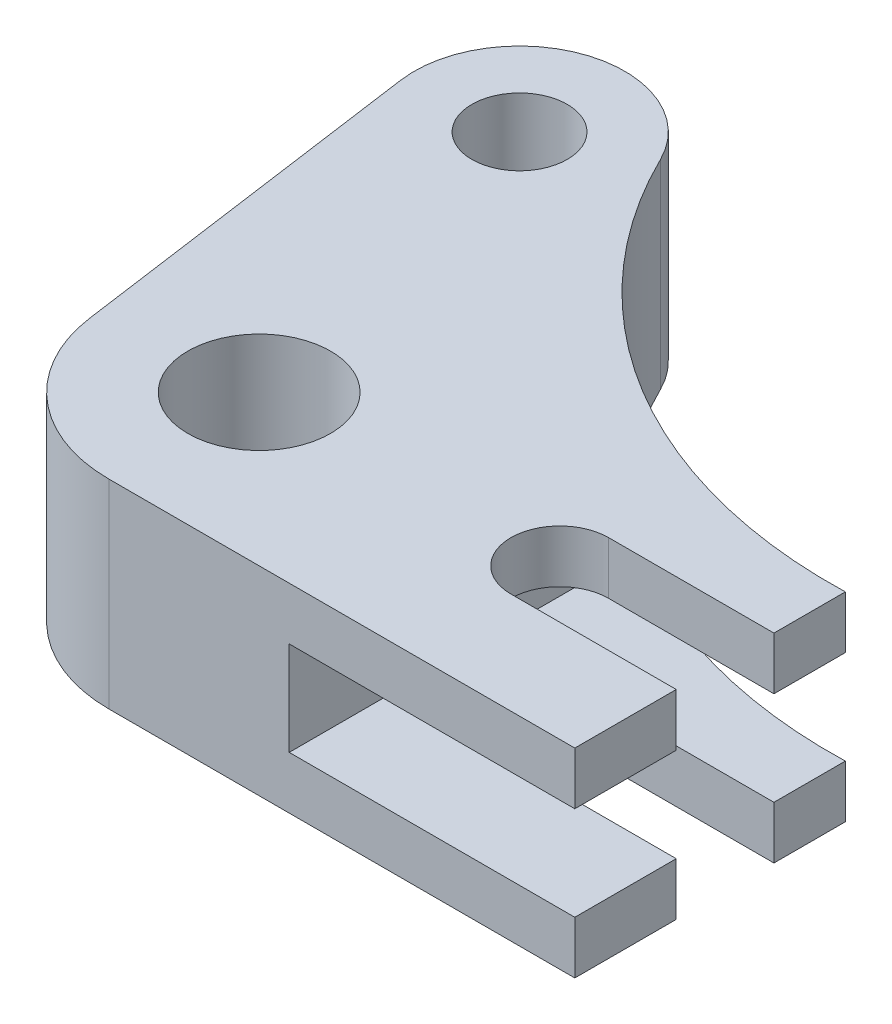
ISO-10303-21;
HEADER;
FILE_DESCRIPTION(('STEP AP214'),'2;1');
FILE_NAME('part.step','',(''),(''),'','','');
FILE_SCHEMA(('AUTOMOTIVE_DESIGN { 1 0 10303 214 1 1 1 1 }'));
ENDSEC;
DATA;
#1=APPLICATION_CONTEXT('core data for automotive mechanical design processes');
#2=APPLICATION_PROTOCOL_DEFINITION('international standard','automotive_design',2000,#1);
#3=PRODUCT_CONTEXT('',#1,'mechanical');
#4=PRODUCT('Part','Part','',(#3));
#5=PRODUCT_RELATED_PRODUCT_CATEGORY('part','',(#4));
#6=PRODUCT_DEFINITION_FORMATION('','',#4);
#7=PRODUCT_DEFINITION_CONTEXT('part definition',#1,'design');
#8=PRODUCT_DEFINITION('design','',#6,#7);
#9=PRODUCT_DEFINITION_SHAPE('','',#8);
#10=(LENGTH_UNIT() NAMED_UNIT(*) SI_UNIT(.MILLI.,.METRE.));
#11=(NAMED_UNIT(*) PLANE_ANGLE_UNIT() SI_UNIT($,.RADIAN.));
#12=(NAMED_UNIT(*) SI_UNIT($,.STERADIAN.) SOLID_ANGLE_UNIT());
#13=UNCERTAINTY_MEASURE_WITH_UNIT(LENGTH_MEASURE(1.E-05),#10,'distance_accuracy_value','');
#14=(GEOMETRIC_REPRESENTATION_CONTEXT(3) GLOBAL_UNCERTAINTY_ASSIGNED_CONTEXT((#13)) GLOBAL_UNIT_ASSIGNED_CONTEXT((#10,
#11,#12)) REPRESENTATION_CONTEXT('',''));
#15=CARTESIAN_POINT('',(0.,0.,0.));
#16=DIRECTION('',(0.,0.,1.));
#17=DIRECTION('',(1.,0.,0.));
#18=AXIS2_PLACEMENT_3D('',#15,#16,#17);
#19=CARTESIAN_POINT('',(-1.94499816987299,13.25,-102.971762572887));
#20=DIRECTION('',(0.,-1.,0.));
#21=DIRECTION('',(0.,0.,-1.));
#22=AXIS2_PLACEMENT_3D('',#19,#20,#21);
#23=CYLINDRICAL_SURFACE('',#22,67.);
#24=DIRECTION('',(0.,-1.,0.));
#25=VECTOR('',#24,1.);
#26=CARTESIAN_POINT('',(0.,13.25,-36.));
#27=LINE('',#26,#25);
#28=CARTESIAN_POINT('',(0.,13.25,-36.));
#29=VERTEX_POINT('',#28);
#30=CARTESIAN_POINT('',(0.,6.25,-36.));
#31=VERTEX_POINT('',#30);
#32=EDGE_CURVE('E212',#29,#31,#27,.T.);
#33=ORIENTED_EDGE('',*,*,#32,.T.);
#34=CARTESIAN_POINT('',(-1.94499816987299,6.25,-102.971762572887));
#35=DIRECTION('',(0.,-1.,0.));
#36=DIRECTION('',(0.,0.,-1.));
#37=AXIS2_PLACEMENT_3D('',#34,#35,#36);
#38=CIRCLE('',#37,67.);
#39=CARTESIAN_POINT('',(-38.,6.25,-46.50020474924));
#40=VERTEX_POINT('',#39);
#41=EDGE_CURVE('E357',#31,#40,#38,.T.);
#42=ORIENTED_EDGE('',*,*,#41,.T.);
#43=DIRECTION('',(0.,-1.,0.));
#44=VECTOR('',#43,1.);
#45=CARTESIAN_POINT('',(-38.,13.25,-46.50020474924));
#46=LINE('',#45,#44);
#47=CARTESIAN_POINT('',(-38.,-6.25,-46.50020474924));
#48=VERTEX_POINT('',#47);
#49=EDGE_CURVE('E181',#48,#40,#46,.F.);
#50=ORIENTED_EDGE('',*,*,#49,.F.);
#51=CARTESIAN_POINT('',(-1.94499816987299,-6.25,-102.971762572887));
#52=DIRECTION('',(0.,1.,0.));
#53=DIRECTION('',(0.,0.,1.));
#54=AXIS2_PLACEMENT_3D('',#51,#52,#53);
#55=CIRCLE('',#54,67.);
#56=CARTESIAN_POINT('',(0.,-6.25,-36.));
#57=VERTEX_POINT('',#56);
#58=EDGE_CURVE('E240',#48,#57,#55,.T.);
#59=ORIENTED_EDGE('',*,*,#58,.T.);
#60=CARTESIAN_POINT('',(0.,-13.25,-36.));
#61=VERTEX_POINT('',#60);
#62=EDGE_CURVE('E108',#57,#61,#27,.T.);
#63=ORIENTED_EDGE('',*,*,#62,.T.);
#64=CARTESIAN_POINT('',(-1.94499816987299,-13.25,-102.971762572887));
#65=DIRECTION('',(0.,1.,0.));
#66=DIRECTION('',(0.,0.,1.));
#67=AXIS2_PLACEMENT_3D('',#64,#65,#66);
#68=CIRCLE('',#67,67.);
#69=CARTESIAN_POINT('',(-62.1102827092568,-13.25,-73.4906069595979));
#70=VERTEX_POINT('',#69);
#71=EDGE_CURVE('E177',#70,#61,#68,.T.);
#72=ORIENTED_EDGE('',*,*,#71,.F.);
#73=DIRECTION('',(0.,-1.,0.));
#74=VECTOR('',#73,1.);
#75=CARTESIAN_POINT('',(-62.1102827092568,13.25,-73.4906069595979));
#76=LINE('',#75,#74);
#77=CARTESIAN_POINT('',(-62.1102827092568,13.25,-73.4906069595979));
#78=VERTEX_POINT('',#77);
#79=EDGE_CURVE('E114',#78,#70,#76,.T.);
#80=ORIENTED_EDGE('',*,*,#79,.F.);
#81=CARTESIAN_POINT('',(-1.94499816987299,13.25,-102.971762572887));
#82=DIRECTION('',(0.,1.,0.));
#83=DIRECTION('',(0.,0.,1.));
#84=AXIS2_PLACEMENT_3D('',#81,#82,#83);
#85=CIRCLE('',#84,67.);
#86=EDGE_CURVE('E211',#78,#29,#85,.T.);
#87=ORIENTED_EDGE('',*,*,#86,.T.);
#88=EDGE_LOOP('',(#33,#42,#50,#59,#63,#72,#80,#87));
#89=FACE_BOUND('',#88,.T.);
#90=ADVANCED_FACE('F45',(#89),#23,.F.);
#91=CARTESIAN_POINT('',(0.,13.25,0.));
#92=DIRECTION('',(0.,0.,1.));
#93=DIRECTION('',(1.,0.,0.));
#94=AXIS2_PLACEMENT_3D('',#91,#92,#93);
#95=PLANE('',#94);
#96=DIRECTION('',(0.,1.,0.));
#97=VECTOR('',#96,1.);
#98=CARTESIAN_POINT('',(-38.,-6.25,0.));
#99=LINE('',#98,#97);
#100=CARTESIAN_POINT('',(-38.,-6.25,0.));
#101=VERTEX_POINT('',#100);
#102=CARTESIAN_POINT('',(-38.,6.25,0.));
#103=VERTEX_POINT('',#102);
#104=EDGE_CURVE('E328',#101,#103,#99,.T.);
#105=ORIENTED_EDGE('',*,*,#104,.T.);
#106=DIRECTION('',(1.,0.,0.));
#107=VECTOR('',#106,1.);
#108=CARTESIAN_POINT('',(-38.,6.25,0.));
#109=LINE('',#108,#107);
#110=CARTESIAN_POINT('',(0.,6.25,0.));
#111=VERTEX_POINT('',#110);
#112=EDGE_CURVE('E333',#103,#111,#109,.T.);
#113=ORIENTED_EDGE('',*,*,#112,.T.);
#114=DIRECTION('',(0.,-1.,0.));
#115=VECTOR('',#114,1.);
#116=CARTESIAN_POINT('',(0.,13.25,0.));
#117=LINE('',#116,#115);
#118=CARTESIAN_POINT('',(0.,13.25,0.));
#119=VERTEX_POINT('',#118);
#120=EDGE_CURVE('E224',#119,#111,#117,.T.);
#121=ORIENTED_EDGE('',*,*,#120,.F.);
#122=DIRECTION('',(-1.,0.,0.));
#123=VECTOR('',#122,1.);
#124=CARTESIAN_POINT('',(0.,13.25,0.));
#125=LINE('',#124,#123);
#126=CARTESIAN_POINT('',(-62.,13.25,0.));
#127=VERTEX_POINT('',#126);
#128=EDGE_CURVE('E274',#119,#127,#125,.T.);
#129=ORIENTED_EDGE('',*,*,#128,.T.);
#130=DIRECTION('',(0.,-1.,0.));
#131=VECTOR('',#130,1.);
#132=CARTESIAN_POINT('',(-62.,13.25,0.));
#133=LINE('',#132,#131);
#134=CARTESIAN_POINT('',(-62.,-13.25,0.));
#135=VERTEX_POINT('',#134);
#136=EDGE_CURVE('E227',#127,#135,#133,.T.);
#137=ORIENTED_EDGE('',*,*,#136,.T.);
#138=DIRECTION('',(-1.,0.,0.));
#139=VECTOR('',#138,1.);
#140=CARTESIAN_POINT('',(0.,-13.25,0.));
#141=LINE('',#140,#139);
#142=CARTESIAN_POINT('',(0.,-13.25,0.));
#143=VERTEX_POINT('',#142);
#144=EDGE_CURVE('E188',#143,#135,#141,.T.);
#145=ORIENTED_EDGE('',*,*,#144,.F.);
#146=CARTESIAN_POINT('',(0.,-6.25,0.));
#147=VERTEX_POINT('',#146);
#148=EDGE_CURVE('E223',#147,#143,#117,.T.);
#149=ORIENTED_EDGE('',*,*,#148,.F.);
#150=DIRECTION('',(1.,0.,0.));
#151=VECTOR('',#150,1.);
#152=CARTESIAN_POINT('',(-38.,-6.25,0.));
#153=LINE('',#152,#151);
#154=EDGE_CURVE('E336',#101,#147,#153,.T.);
#155=ORIENTED_EDGE('',*,*,#154,.F.);
#156=EDGE_LOOP('',(#105,#113,#121,#129,#137,#145,#149,#155));
#157=FACE_BOUND('',#156,.T.);
#158=ADVANCED_FACE('F338',(#157),#95,.T.);
#159=CARTESIAN_POINT('',(0.,13.25,0.));
#160=DIRECTION('',(-1.,0.,0.));
#161=DIRECTION('',(0.,0.,1.));
#162=AXIS2_PLACEMENT_3D('',#159,#160,#161);
#163=PLANE('',#162);
#164=DIRECTION('',(0.,0.,-1.));
#165=VECTOR('',#164,1.);
#166=CARTESIAN_POINT('',(0.,6.25,0.));
#167=LINE('',#166,#165);
#168=CARTESIAN_POINT('',(0.,6.25,-13.5));
#169=VERTEX_POINT('',#168);
#170=EDGE_CURVE('E288',#111,#169,#167,.T.);
#171=ORIENTED_EDGE('',*,*,#170,.T.);
#172=DIRECTION('',(0.,-1.,0.));
#173=VECTOR('',#172,1.);
#174=CARTESIAN_POINT('',(0.,13.25,-13.5));
#175=LINE('',#174,#173);
#176=CARTESIAN_POINT('',(0.,13.25,-13.5));
#177=VERTEX_POINT('',#176);
#178=EDGE_CURVE('E220',#177,#169,#175,.T.);
#179=ORIENTED_EDGE('',*,*,#178,.F.);
#180=DIRECTION('',(0.,0.,-1.));
#181=VECTOR('',#180,1.);
#182=CARTESIAN_POINT('',(0.,13.25,0.));
#183=LINE('',#182,#181);
#184=EDGE_CURVE('E166',#119,#177,#183,.T.);
#185=ORIENTED_EDGE('',*,*,#184,.F.);
#186=ORIENTED_EDGE('',*,*,#120,.T.);
#187=EDGE_LOOP('',(#171,#179,#185,#186));
#188=FACE_BOUND('',#187,.T.);
#189=ADVANCED_FACE('F285',(#188),#163,.F.);
#190=DIRECTION('',(0.,0.,1.));
#191=VECTOR('',#190,1.);
#192=CARTESIAN_POINT('',(0.,-6.25,-73.3389449580955));
#193=LINE('',#192,#191);
#194=CARTESIAN_POINT('',(0.,-6.25,-13.5));
#195=VERTEX_POINT('',#194);
#196=EDGE_CURVE('E340',#195,#147,#193,.T.);
#197=ORIENTED_EDGE('',*,*,#196,.T.);
#198=ORIENTED_EDGE('',*,*,#148,.T.);
#199=DIRECTION('',(0.,0.,-1.));
#200=VECTOR('',#199,1.);
#201=CARTESIAN_POINT('',(0.,-13.25,0.));
#202=LINE('',#201,#200);
#203=CARTESIAN_POINT('',(0.,-13.25,-13.5));
#204=VERTEX_POINT('',#203);
#205=EDGE_CURVE('E191',#143,#204,#202,.T.);
#206=ORIENTED_EDGE('',*,*,#205,.T.);
#207=EDGE_CURVE('E219',#195,#204,#175,.T.);
#208=ORIENTED_EDGE('',*,*,#207,.F.);
#209=EDGE_LOOP('',(#197,#198,#206,#208));
#210=FACE_BOUND('',#209,.T.);
#211=ADVANCED_FACE('F381',(#210),#163,.F.);
#212=CARTESIAN_POINT('',(0.,13.25,-13.5));
#213=DIRECTION('',(0.,0.,-1.));
#214=DIRECTION('',(-1.,0.,0.));
#215=AXIS2_PLACEMENT_3D('',#212,#213,#214);
#216=PLANE('',#215);
#217=ORIENTED_EDGE('',*,*,#178,.T.);
#218=DIRECTION('',(-1.,0.,0.));
#219=VECTOR('',#218,1.);
#220=CARTESIAN_POINT('',(0.,6.25,-13.5));
#221=LINE('',#220,#219);
#222=CARTESIAN_POINT('',(-22.,6.25,-13.5));
#223=VERTEX_POINT('',#222);
#224=EDGE_CURVE('E293',#169,#223,#221,.T.);
#225=ORIENTED_EDGE('',*,*,#224,.T.);
#226=DIRECTION('',(0.,-1.,0.));
#227=VECTOR('',#226,1.);
#228=CARTESIAN_POINT('',(-22.,13.25,-13.5));
#229=LINE('',#228,#227);
#230=CARTESIAN_POINT('',(-22.,13.25,-13.5));
#231=VERTEX_POINT('',#230);
#232=EDGE_CURVE('E217',#231,#223,#229,.T.);
#233=ORIENTED_EDGE('',*,*,#232,.F.);
#234=DIRECTION('',(1.,0.,0.));
#235=VECTOR('',#234,1.);
#236=CARTESIAN_POINT('',(0.,13.25,-13.5));
#237=LINE('',#236,#235);
#238=EDGE_CURVE('E164',#231,#177,#237,.T.);
#239=ORIENTED_EDGE('',*,*,#238,.T.);
#240=EDGE_LOOP('',(#217,#225,#233,#239));
#241=FACE_BOUND('',#240,.T.);
#242=ADVANCED_FACE('F291',(#241),#216,.T.);
#243=CARTESIAN_POINT('',(-22.,-6.25,-13.5));
#244=VERTEX_POINT('',#243);
#245=CARTESIAN_POINT('',(-22.,-13.25,-13.5));
#246=VERTEX_POINT('',#245);
#247=EDGE_CURVE('E151',#244,#246,#229,.T.);
#248=ORIENTED_EDGE('',*,*,#247,.F.);
#249=DIRECTION('',(1.,0.,0.));
#250=VECTOR('',#249,1.);
#251=CARTESIAN_POINT('',(0.,-6.25,-13.5));
#252=LINE('',#251,#250);
#253=EDGE_CURVE('E251',#244,#195,#252,.T.);
#254=ORIENTED_EDGE('',*,*,#253,.T.);
#255=ORIENTED_EDGE('',*,*,#207,.T.);
#256=DIRECTION('',(1.,0.,0.));
#257=VECTOR('',#256,1.);
#258=CARTESIAN_POINT('',(0.,-13.25,-13.5));
#259=LINE('',#258,#257);
#260=EDGE_CURVE('E194',#246,#204,#259,.T.);
#261=ORIENTED_EDGE('',*,*,#260,.F.);
#262=EDGE_LOOP('',(#248,#254,#255,#261));
#263=FACE_BOUND('',#262,.T.);
#264=ADVANCED_FACE('F472',(#263),#216,.T.);
#265=CARTESIAN_POINT('',(-22.,13.25,-20.));
#266=DIRECTION('',(0.,-1.,0.));
#267=DIRECTION('',(0.,0.,-1.));
#268=AXIS2_PLACEMENT_3D('',#265,#266,#267);
#269=CYLINDRICAL_SURFACE('',#268,6.5);
#270=ORIENTED_EDGE('',*,*,#232,.T.);
#271=CARTESIAN_POINT('',(-22.,6.25,-20.));
#272=DIRECTION('',(0.,-1.,0.));
#273=DIRECTION('',(0.,0.,-1.));
#274=AXIS2_PLACEMENT_3D('',#271,#272,#273);
#275=CIRCLE('',#274,6.5);
#276=CARTESIAN_POINT('',(-22.,6.25,-26.5));
#277=VERTEX_POINT('',#276);
#278=EDGE_CURVE('E148',#223,#277,#275,.T.);
#279=ORIENTED_EDGE('',*,*,#278,.T.);
#280=DIRECTION('',(0.,-1.,0.));
#281=VECTOR('',#280,1.);
#282=CARTESIAN_POINT('',(-22.,13.25,-26.5));
#283=LINE('',#282,#281);
#284=CARTESIAN_POINT('',(-22.,13.25,-26.5));
#285=VERTEX_POINT('',#284);
#286=EDGE_CURVE('E140',#285,#277,#283,.T.);
#287=ORIENTED_EDGE('',*,*,#286,.F.);
#288=CARTESIAN_POINT('',(-22.,13.25,-20.));
#289=DIRECTION('',(0.,1.,0.));
#290=DIRECTION('',(0.,0.,1.));
#291=AXIS2_PLACEMENT_3D('',#288,#289,#290);
#292=CIRCLE('',#291,6.5);
#293=EDGE_CURVE('E145',#285,#231,#292,.T.);
#294=ORIENTED_EDGE('',*,*,#293,.T.);
#295=EDGE_LOOP('',(#270,#279,#287,#294));
#296=FACE_BOUND('',#295,.T.);
#297=ADVANCED_FACE('F143',(#296),#269,.F.);
#298=CARTESIAN_POINT('',(-22.,-6.25,-26.5));
#299=VERTEX_POINT('',#298);
#300=CARTESIAN_POINT('',(-22.,-13.25,-26.5));
#301=VERTEX_POINT('',#300);
#302=EDGE_CURVE('E152',#299,#301,#283,.T.);
#303=ORIENTED_EDGE('',*,*,#302,.F.);
#304=CARTESIAN_POINT('',(-22.,-6.25,-20.));
#305=DIRECTION('',(0.,1.,0.));
#306=DIRECTION('',(0.,0.,1.));
#307=AXIS2_PLACEMENT_3D('',#304,#305,#306);
#308=CIRCLE('',#307,6.5);
#309=EDGE_CURVE('E349',#299,#244,#308,.T.);
#310=ORIENTED_EDGE('',*,*,#309,.T.);
#311=ORIENTED_EDGE('',*,*,#247,.T.);
#312=CARTESIAN_POINT('',(-22.,-13.25,-20.));
#313=DIRECTION('',(0.,1.,0.));
#314=DIRECTION('',(0.,0.,1.));
#315=AXIS2_PLACEMENT_3D('',#312,#313,#314);
#316=CIRCLE('',#315,6.5);
#317=EDGE_CURVE('E197',#301,#246,#316,.T.);
#318=ORIENTED_EDGE('',*,*,#317,.F.);
#319=EDGE_LOOP('',(#303,#310,#311,#318));
#320=FACE_BOUND('',#319,.T.);
#321=ADVANCED_FACE('F457',(#320),#269,.F.);
#322=CARTESIAN_POINT('',(0.,13.25,-26.5));
#323=DIRECTION('',(0.,0.,-1.));
#324=DIRECTION('',(-1.,0.,0.));
#325=AXIS2_PLACEMENT_3D('',#322,#323,#324);
#326=PLANE('',#325);
#327=DIRECTION('',(-1.,0.,0.));
#328=VECTOR('',#327,1.);
#329=CARTESIAN_POINT('',(0.,6.25,-26.5));
#330=LINE('',#329,#328);
#331=CARTESIAN_POINT('',(0.,6.25,-26.5));
#332=VERTEX_POINT('',#331);
#333=EDGE_CURVE('E250',#332,#277,#330,.T.);
#334=ORIENTED_EDGE('',*,*,#333,.F.);
#335=DIRECTION('',(0.,-1.,0.));
#336=VECTOR('',#335,1.);
#337=CARTESIAN_POINT('',(0.,13.25,-26.5));
#338=LINE('',#337,#336);
#339=CARTESIAN_POINT('',(0.,13.25,-26.5));
#340=VERTEX_POINT('',#339);
#341=EDGE_CURVE('E158',#340,#332,#338,.T.);
#342=ORIENTED_EDGE('',*,*,#341,.F.);
#343=DIRECTION('',(1.,0.,0.));
#344=VECTOR('',#343,1.);
#345=CARTESIAN_POINT('',(0.,13.25,-26.5));
#346=LINE('',#345,#344);
#347=EDGE_CURVE('E155',#285,#340,#346,.T.);
#348=ORIENTED_EDGE('',*,*,#347,.F.);
#349=ORIENTED_EDGE('',*,*,#286,.T.);
#350=EDGE_LOOP('',(#334,#342,#348,#349));
#351=FACE_BOUND('',#350,.T.);
#352=ADVANCED_FACE('F156',(#351),#326,.F.);
#353=DIRECTION('',(1.,0.,0.));
#354=VECTOR('',#353,1.);
#355=CARTESIAN_POINT('',(0.,-6.25,-26.5));
#356=LINE('',#355,#354);
#357=CARTESIAN_POINT('',(0.,-6.25,-26.5));
#358=VERTEX_POINT('',#357);
#359=EDGE_CURVE('E59',#299,#358,#356,.T.);
#360=ORIENTED_EDGE('',*,*,#359,.F.);
#361=ORIENTED_EDGE('',*,*,#302,.T.);
#362=DIRECTION('',(1.,0.,0.));
#363=VECTOR('',#362,1.);
#364=CARTESIAN_POINT('',(0.,-13.25,-26.5));
#365=LINE('',#364,#363);
#366=CARTESIAN_POINT('',(0.,-13.25,-26.5));
#367=VERTEX_POINT('',#366);
#368=EDGE_CURVE('E200',#301,#367,#365,.T.);
#369=ORIENTED_EDGE('',*,*,#368,.T.);
#370=EDGE_CURVE('E215',#358,#367,#338,.T.);
#371=ORIENTED_EDGE('',*,*,#370,.F.);
#372=EDGE_LOOP('',(#360,#361,#369,#371));
#373=FACE_BOUND('',#372,.T.);
#374=ADVANCED_FACE('F363',(#373),#326,.F.);
#375=CARTESIAN_POINT('',(0.,13.25,0.));
#376=DIRECTION('',(-1.,0.,0.));
#377=DIRECTION('',(0.,0.,1.));
#378=AXIS2_PLACEMENT_3D('',#375,#376,#377);
#379=PLANE('',#378);
#380=DIRECTION('',(0.,0.,1.));
#381=VECTOR('',#380,1.);
#382=CARTESIAN_POINT('',(0.,6.25,0.));
#383=LINE('',#382,#381);
#384=EDGE_CURVE('E11',#31,#332,#383,.T.);
#385=ORIENTED_EDGE('',*,*,#384,.F.);
#386=ORIENTED_EDGE('',*,*,#32,.F.);
#387=DIRECTION('',(0.,0.,-1.));
#388=VECTOR('',#387,1.);
#389=CARTESIAN_POINT('',(0.,13.25,0.));
#390=LINE('',#389,#388);
#391=EDGE_CURVE('E68',#340,#29,#390,.T.);
#392=ORIENTED_EDGE('',*,*,#391,.F.);
#393=ORIENTED_EDGE('',*,*,#341,.T.);
#394=EDGE_LOOP('',(#385,#386,#392,#393));
#395=FACE_BOUND('',#394,.T.);
#396=ADVANCED_FACE('F361',(#395),#379,.F.);
#397=DIRECTION('',(0.,0.,-1.));
#398=VECTOR('',#397,1.);
#399=CARTESIAN_POINT('',(0.,-6.25,0.));
#400=LINE('',#399,#398);
#401=EDGE_CURVE('E52',#358,#57,#400,.T.);
#402=ORIENTED_EDGE('',*,*,#401,.F.);
#403=ORIENTED_EDGE('',*,*,#370,.T.);
#404=DIRECTION('',(0.,0.,-1.));
#405=VECTOR('',#404,1.);
#406=CARTESIAN_POINT('',(0.,-13.25,0.));
#407=LINE('',#406,#405);
#408=EDGE_CURVE('E203',#367,#61,#407,.T.);
#409=ORIENTED_EDGE('',*,*,#408,.T.);
#410=ORIENTED_EDGE('',*,*,#62,.F.);
#411=EDGE_LOOP('',(#402,#403,#409,#410));
#412=FACE_BOUND('',#411,.T.);
#413=ADVANCED_FACE('F253',(#412),#379,.F.);
#414=CARTESIAN_POINT('',(-74.6821332100236,13.25,-67.3303654881643));
#415=DIRECTION('',(0.,-1.,0.));
#416=DIRECTION('',(0.,0.,-1.));
#417=AXIS2_PLACEMENT_3D('',#414,#415,#416);
#418=CYLINDRICAL_SURFACE('',#417,14.);
#419=CARTESIAN_POINT('',(-74.6821332100236,-13.25,-67.3303654881643));
#420=DIRECTION('',(0.,1.,0.));
#421=DIRECTION('',(0.,0.,1.));
#422=AXIS2_PLACEMENT_3D('',#419,#420,#421);
#423=CIRCLE('',#422,14.);
#424=CARTESIAN_POINT('',(-88.5470217071029,-13.25,-65.3900389786416));
#425=VERTEX_POINT('',#424);
#426=EDGE_CURVE('E180',#70,#425,#423,.T.);
#427=ORIENTED_EDGE('',*,*,#426,.T.);
#428=DIRECTION('',(0.,-1.,0.));
#429=VECTOR('',#428,1.);
#430=CARTESIAN_POINT('',(-88.5470217071029,13.25,-65.3900389786416));
#431=LINE('',#430,#429);
#432=CARTESIAN_POINT('',(-88.5470217071029,13.25,-65.3900389786416));
#433=VERTEX_POINT('',#432);
#434=EDGE_CURVE('E232',#433,#425,#431,.T.);
#435=ORIENTED_EDGE('',*,*,#434,.F.);
#436=CARTESIAN_POINT('',(-74.6821332100236,13.25,-67.3303654881643));
#437=DIRECTION('',(0.,1.,0.));
#438=DIRECTION('',(0.,0.,1.));
#439=AXIS2_PLACEMENT_3D('',#436,#437,#438);
#440=CIRCLE('',#439,14.);
#441=EDGE_CURVE('E272',#78,#433,#440,.T.);
#442=ORIENTED_EDGE('',*,*,#441,.F.);
#443=ORIENTED_EDGE('',*,*,#79,.T.);
#444=EDGE_LOOP('',(#427,#435,#442,#443));
#445=FACE_BOUND('',#444,.T.);
#446=ADVANCED_FACE('F264',(#445),#418,.T.);
#447=CARTESIAN_POINT('',(-77.8709123132272,13.25,10.8976711578965));
#448=DIRECTION('',(0.990349178362811,0.,-0.138594750680193));
#449=DIRECTION('',(-0.138594750680193,0.,-0.990349178362811));
#450=AXIS2_PLACEMENT_3D('',#447,#448,#449);
#451=PLANE('',#450);
#452=DIRECTION('',(0.138594750680193,0.,0.990349178362811));
#453=VECTOR('',#452,1.);
#454=CARTESIAN_POINT('',(-77.8709123132272,-13.25,10.8976711578965));
#455=LINE('',#454,#453);
#456=CARTESIAN_POINT('',(-81.8069835672562,-13.25,-17.2281049863961));
#457=VERTEX_POINT('',#456);
#458=EDGE_CURVE('E183',#425,#457,#455,.T.);
#459=ORIENTED_EDGE('',*,*,#458,.T.);
#460=DIRECTION('',(0.,-1.,0.));
#461=VECTOR('',#460,1.);
#462=CARTESIAN_POINT('',(-81.8069835672562,13.25,-17.2281049863961));
#463=LINE('',#462,#461);
#464=CARTESIAN_POINT('',(-81.8069835672562,13.25,-17.2281049863961));
#465=VERTEX_POINT('',#464);
#466=EDGE_CURVE('E229',#465,#457,#463,.T.);
#467=ORIENTED_EDGE('',*,*,#466,.F.);
#468=DIRECTION('',(0.138594750680193,0.,0.990349178362811));
#469=VECTOR('',#468,1.);
#470=CARTESIAN_POINT('',(-77.8709123132272,13.25,10.8976711578965));
#471=LINE('',#470,#469);
#472=EDGE_CURVE('E269',#433,#465,#471,.T.);
#473=ORIENTED_EDGE('',*,*,#472,.F.);
#474=ORIENTED_EDGE('',*,*,#434,.T.);
#475=EDGE_LOOP('',(#459,#467,#473,#474));
#476=FACE_BOUND('',#475,.T.);
#477=ADVANCED_FACE('F267',(#476),#451,.F.);
#478=CARTESIAN_POINT('',(-62.,13.25,-20.));
#479=DIRECTION('',(0.,-1.,0.));
#480=DIRECTION('',(0.,0.,-1.));
#481=AXIS2_PLACEMENT_3D('',#478,#479,#480);
#482=CYLINDRICAL_SURFACE('',#481,20.);
#483=CARTESIAN_POINT('',(-62.,-13.25,-20.));
#484=DIRECTION('',(0.,1.,0.));
#485=DIRECTION('',(0.,0.,1.));
#486=AXIS2_PLACEMENT_3D('',#483,#484,#485);
#487=CIRCLE('',#486,20.);
#488=EDGE_CURVE('E185',#457,#135,#487,.T.);
#489=ORIENTED_EDGE('',*,*,#488,.T.);
#490=ORIENTED_EDGE('',*,*,#136,.F.);
#491=CARTESIAN_POINT('',(-62.,13.25,-20.));
#492=DIRECTION('',(0.,1.,0.));
#493=DIRECTION('',(0.,0.,1.));
#494=AXIS2_PLACEMENT_3D('',#491,#492,#493);
#495=CIRCLE('',#494,20.);
#496=EDGE_CURVE('E271',#465,#127,#495,.T.);
#497=ORIENTED_EDGE('',*,*,#496,.F.);
#498=ORIENTED_EDGE('',*,*,#466,.T.);
#499=EDGE_LOOP('',(#489,#490,#497,#498));
#500=FACE_BOUND('',#499,.T.);
#501=ADVANCED_FACE('F385',(#500),#482,.T.);
#502=CARTESIAN_POINT('',(-74.6821332100236,13.25,-67.3303654881643));
#503=DIRECTION('',(0.,-1.,0.));
#504=DIRECTION('',(0.,0.,-1.));
#505=AXIS2_PLACEMENT_3D('',#502,#503,#504);
#506=CYLINDRICAL_SURFACE('',#505,6.34999999999999);
#507=CARTESIAN_POINT('',(-74.6821332100236,13.25,-67.3303654881643));
#508=DIRECTION('',(0.,1.,0.));
#509=DIRECTION('',(0.,0.,1.));
#510=AXIS2_PLACEMENT_3D('',#507,#508,#509);
#511=CIRCLE('',#510,6.34999999999999);
#512=CARTESIAN_POINT('',(-74.6821332100236,13.25,-60.9803654881643));
#513=VERTEX_POINT('',#512);
#514=EDGE_CURVE('E171',#513,#513,#511,.T.);
#515=ORIENTED_EDGE('',*,*,#514,.T.);
#516=EDGE_LOOP('',(#515));
#517=FACE_BOUND('',#516,.T.);
#518=CARTESIAN_POINT('',(-74.6821332100236,-13.25,-67.3303654881643));
#519=DIRECTION('',(0.,1.,0.));
#520=DIRECTION('',(0.,0.,1.));
#521=AXIS2_PLACEMENT_3D('',#518,#519,#520);
#522=CIRCLE('',#521,6.34999999999999);
#523=CARTESIAN_POINT('',(-74.6821332100236,-13.25,-60.9803654881643));
#524=VERTEX_POINT('',#523);
#525=EDGE_CURVE('E205',#524,#524,#522,.T.);
#526=ORIENTED_EDGE('',*,*,#525,.F.);
#527=EDGE_LOOP('',(#526));
#528=FACE_BOUND('',#527,.T.);
#529=ADVANCED_FACE('F388',(#517,#528),#506,.F.);
#530=CARTESIAN_POINT('',(-62.,13.25,-20.));
#531=DIRECTION('',(0.,-1.,0.));
#532=DIRECTION('',(0.,0.,-1.));
#533=AXIS2_PLACEMENT_3D('',#530,#531,#532);
#534=CYLINDRICAL_SURFACE('',#533,9.5);
#535=CARTESIAN_POINT('',(-62.,13.25,-20.));
#536=DIRECTION('',(0.,1.,0.));
#537=DIRECTION('',(0.,0.,1.));
#538=AXIS2_PLACEMENT_3D('',#535,#536,#537);
#539=CIRCLE('',#538,9.5);
#540=CARTESIAN_POINT('',(-62.,13.25,-10.5));
#541=VERTEX_POINT('',#540);
#542=EDGE_CURVE('E174',#541,#541,#539,.T.);
#543=ORIENTED_EDGE('',*,*,#542,.T.);
#544=EDGE_LOOP('',(#543));
#545=FACE_BOUND('',#544,.T.);
#546=CARTESIAN_POINT('',(-62.,-13.25,-20.));
#547=DIRECTION('',(0.,1.,0.));
#548=DIRECTION('',(0.,0.,1.));
#549=AXIS2_PLACEMENT_3D('',#546,#547,#548);
#550=CIRCLE('',#549,9.5);
#551=CARTESIAN_POINT('',(-62.,-13.25,-10.5));
#552=VERTEX_POINT('',#551);
#553=EDGE_CURVE('E208',#552,#552,#550,.T.);
#554=ORIENTED_EDGE('',*,*,#553,.F.);
#555=EDGE_LOOP('',(#554));
#556=FACE_BOUND('',#555,.T.);
#557=ADVANCED_FACE('F411',(#545,#556),#534,.F.);
#558=CARTESIAN_POINT('',(0.,13.25,0.));
#559=DIRECTION('',(0.,1.,0.));
#560=DIRECTION('',(0.,0.,1.));
#561=AXIS2_PLACEMENT_3D('',#558,#559,#560);
#562=PLANE('',#561);
#563=ORIENTED_EDGE('',*,*,#86,.F.);
#564=ORIENTED_EDGE('',*,*,#441,.T.);
#565=ORIENTED_EDGE('',*,*,#472,.T.);
#566=ORIENTED_EDGE('',*,*,#496,.T.);
#567=ORIENTED_EDGE('',*,*,#128,.F.);
#568=ORIENTED_EDGE('',*,*,#184,.T.);
#569=ORIENTED_EDGE('',*,*,#238,.F.);
#570=ORIENTED_EDGE('',*,*,#293,.F.);
#571=ORIENTED_EDGE('',*,*,#347,.T.);
#572=ORIENTED_EDGE('',*,*,#391,.T.);
#573=EDGE_LOOP('',(#563,#564,#565,#566,#567,#568,#569,#570,#571,#572));
#574=FACE_BOUND('',#573,.T.);
#575=ORIENTED_EDGE('',*,*,#514,.F.);
#576=EDGE_LOOP('',(#575));
#577=FACE_BOUND('',#576,.T.);
#578=ORIENTED_EDGE('',*,*,#542,.F.);
#579=EDGE_LOOP('',(#578));
#580=FACE_BOUND('',#579,.T.);
#581=ADVANCED_FACE('F161',(#574,#577,#580),#562,.T.);
#582=CARTESIAN_POINT('',(0.,-13.25,0.));
#583=DIRECTION('',(0.,1.,0.));
#584=DIRECTION('',(0.,0.,1.));
#585=AXIS2_PLACEMENT_3D('',#582,#583,#584);
#586=PLANE('',#585);
#587=ORIENTED_EDGE('',*,*,#71,.T.);
#588=ORIENTED_EDGE('',*,*,#408,.F.);
#589=ORIENTED_EDGE('',*,*,#368,.F.);
#590=ORIENTED_EDGE('',*,*,#317,.T.);
#591=ORIENTED_EDGE('',*,*,#260,.T.);
#592=ORIENTED_EDGE('',*,*,#205,.F.);
#593=ORIENTED_EDGE('',*,*,#144,.T.);
#594=ORIENTED_EDGE('',*,*,#488,.F.);
#595=ORIENTED_EDGE('',*,*,#458,.F.);
#596=ORIENTED_EDGE('',*,*,#426,.F.);
#597=EDGE_LOOP('',(#587,#588,#589,#590,#591,#592,#593,#594,#595,#596));
#598=FACE_BOUND('',#597,.T.);
#599=ORIENTED_EDGE('',*,*,#525,.T.);
#600=EDGE_LOOP('',(#599));
#601=FACE_BOUND('',#600,.T.);
#602=ORIENTED_EDGE('',*,*,#553,.T.);
#603=EDGE_LOOP('',(#602));
#604=FACE_BOUND('',#603,.T.);
#605=ADVANCED_FACE('F258',(#598,#601,#604),#586,.F.);
#606=CARTESIAN_POINT('',(-38.,6.25,0.));
#607=DIRECTION('',(0.,-1.,0.));
#608=DIRECTION('',(0.,0.,-1.));
#609=AXIS2_PLACEMENT_3D('',#606,#607,#608);
#610=PLANE('',#609);
#611=ORIENTED_EDGE('',*,*,#384,.T.);
#612=ORIENTED_EDGE('',*,*,#333,.T.);
#613=ORIENTED_EDGE('',*,*,#278,.F.);
#614=ORIENTED_EDGE('',*,*,#224,.F.);
#615=ORIENTED_EDGE('',*,*,#170,.F.);
#616=ORIENTED_EDGE('',*,*,#112,.F.);
#617=DIRECTION('',(0.,0.,-1.));
#618=VECTOR('',#617,1.);
#619=CARTESIAN_POINT('',(-38.,6.25,0.));
#620=LINE('',#619,#618);
#621=EDGE_CURVE('E324',#103,#40,#620,.T.);
#622=ORIENTED_EDGE('',*,*,#621,.T.);
#623=ORIENTED_EDGE('',*,*,#41,.F.);
#624=EDGE_LOOP('',(#611,#612,#613,#614,#615,#616,#622,#623));
#625=FACE_BOUND('',#624,.T.);
#626=ADVANCED_FACE('F334',(#625),#610,.T.);
#627=CARTESIAN_POINT('',(-38.,-6.25,-73.3389449580955));
#628=DIRECTION('',(0.,1.,0.));
#629=DIRECTION('',(0.,0.,1.));
#630=AXIS2_PLACEMENT_3D('',#627,#628,#629);
#631=PLANE('',#630);
#632=DIRECTION('',(0.,0.,1.));
#633=VECTOR('',#632,1.);
#634=CARTESIAN_POINT('',(-38.,-6.25,-73.3389449580955));
#635=LINE('',#634,#633);
#636=EDGE_CURVE('E330',#48,#101,#635,.T.);
#637=ORIENTED_EDGE('',*,*,#636,.T.);
#638=ORIENTED_EDGE('',*,*,#154,.T.);
#639=ORIENTED_EDGE('',*,*,#196,.F.);
#640=ORIENTED_EDGE('',*,*,#253,.F.);
#641=ORIENTED_EDGE('',*,*,#309,.F.);
#642=ORIENTED_EDGE('',*,*,#359,.T.);
#643=ORIENTED_EDGE('',*,*,#401,.T.);
#644=ORIENTED_EDGE('',*,*,#58,.F.);
#645=EDGE_LOOP('',(#637,#638,#639,#640,#641,#642,#643,#644));
#646=FACE_BOUND('',#645,.T.);
#647=ADVANCED_FACE('F238',(#646),#631,.T.);
#648=CARTESIAN_POINT('',(-38.,0.,0.));
#649=DIRECTION('',(-1.,0.,0.));
#650=DIRECTION('',(0.,0.,1.));
#651=AXIS2_PLACEMENT_3D('',#648,#649,#650);
#652=PLANE('',#651);
#653=ORIENTED_EDGE('',*,*,#49,.T.);
#654=ORIENTED_EDGE('',*,*,#621,.F.);
#655=ORIENTED_EDGE('',*,*,#104,.F.);
#656=ORIENTED_EDGE('',*,*,#636,.F.);
#657=EDGE_LOOP('',(#653,#654,#655,#656));
#658=FACE_BOUND('',#657,.T.);
#659=ADVANCED_FACE('F326',(#658),#652,.F.);
#660=CLOSED_SHELL('',(#90,#158,#189,#211,#242,#264,#297,#321,#352,#374,#396,#413,#446,#477,#501,
#529,#557,#581,#605,#626,#647,#659));
#661=MANIFOLD_SOLID_BREP('B2',#660);
#662=ADVANCED_BREP_SHAPE_REPRESENTATION('',(#18,#661),#14);
#663=SHAPE_DEFINITION_REPRESENTATION(#9,#662);
ENDSEC;
END-ISO-10303-21;
